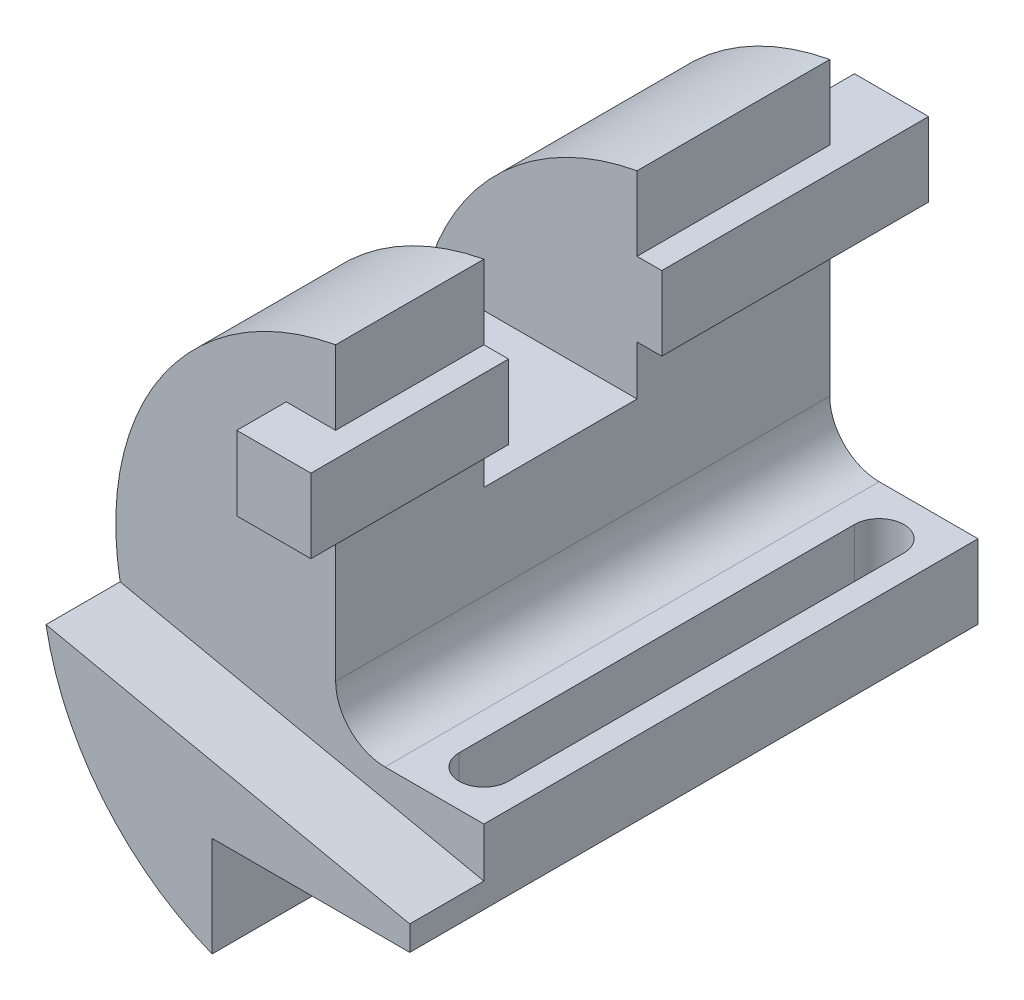
ISO-10303-21;
HEADER;
FILE_DESCRIPTION(('STEP AP214'),'2;1');
FILE_NAME('part.step','',(''),(''),'','','');
FILE_SCHEMA(('AUTOMOTIVE_DESIGN { 1 0 10303 214 1 1 1 1 }'));
ENDSEC;
DATA;
#1=APPLICATION_CONTEXT('core data for automotive mechanical design processes');
#2=APPLICATION_PROTOCOL_DEFINITION('international standard','automotive_design',2000,#1);
#3=PRODUCT_CONTEXT('',#1,'mechanical');
#4=PRODUCT('Part','Part','',(#3));
#5=PRODUCT_RELATED_PRODUCT_CATEGORY('part','',(#4));
#6=PRODUCT_DEFINITION_FORMATION('','',#4);
#7=PRODUCT_DEFINITION_CONTEXT('part definition',#1,'design');
#8=PRODUCT_DEFINITION('design','',#6,#7);
#9=PRODUCT_DEFINITION_SHAPE('','',#8);
#10=(LENGTH_UNIT() NAMED_UNIT(*) SI_UNIT(.MILLI.,.METRE.));
#11=(NAMED_UNIT(*) PLANE_ANGLE_UNIT() SI_UNIT($,.RADIAN.));
#12=(NAMED_UNIT(*) SI_UNIT($,.STERADIAN.) SOLID_ANGLE_UNIT());
#13=UNCERTAINTY_MEASURE_WITH_UNIT(LENGTH_MEASURE(1.E-05),#10,'distance_accuracy_value','');
#14=(GEOMETRIC_REPRESENTATION_CONTEXT(3) GLOBAL_UNCERTAINTY_ASSIGNED_CONTEXT((#13)) GLOBAL_UNIT_ASSIGNED_CONTEXT((#10,
#11,#12)) REPRESENTATION_CONTEXT('',''));
#15=CARTESIAN_POINT('',(0.,0.,0.));
#16=DIRECTION('',(0.,0.,1.));
#17=DIRECTION('',(1.,0.,0.));
#18=AXIS2_PLACEMENT_3D('',#15,#16,#17);
#19=CARTESIAN_POINT('',(0.,0.,-100.));
#20=DIRECTION('',(0.,0.,1.));
#21=DIRECTION('',(1.,0.,0.));
#22=AXIS2_PLACEMENT_3D('',#19,#20,#21);
#23=PLANE('',#22);
#24=DIRECTION('',(1.,0.,0.));
#25=VECTOR('',#24,1.);
#26=CARTESIAN_POINT('',(-4.99999999999999,38.5747141849586,-100.));
#27=LINE('',#26,#25);
#28=CARTESIAN_POINT('',(-20.,38.5747141849586,-100.));
#29=VERTEX_POINT('',#28);
#30=CARTESIAN_POINT('',(-9.99999999999999,38.5747141849586,-100.));
#31=VERTEX_POINT('',#30);
#32=EDGE_CURVE('E254',#29,#31,#27,.T.);
#33=ORIENTED_EDGE('',*,*,#32,.F.);
#34=DIRECTION('',(0.,1.,0.));
#35=VECTOR('',#34,1.);
#36=CARTESIAN_POINT('',(-20.,38.5747141849586,-100.));
#37=LINE('',#36,#35);
#38=CARTESIAN_POINT('',(-20.,23.5747141849586,-100.));
#39=VERTEX_POINT('',#38);
#40=EDGE_CURVE('E247',#39,#29,#37,.T.);
#41=ORIENTED_EDGE('',*,*,#40,.F.);
#42=DIRECTION('',(-1.,0.,0.));
#43=VECTOR('',#42,1.);
#44=CARTESIAN_POINT('',(-4.99999999999999,23.5747141849586,-100.));
#45=LINE('',#44,#43);
#46=CARTESIAN_POINT('',(-9.99999999999999,23.5747141849586,-100.));
#47=VERTEX_POINT('',#46);
#48=EDGE_CURVE('E262',#47,#39,#45,.T.);
#49=ORIENTED_EDGE('',*,*,#48,.F.);
#50=DIRECTION('',(0.,1.,0.));
#51=VECTOR('',#50,1.);
#52=CARTESIAN_POINT('',(-10.,53.5747141849586,-100.));
#53=LINE('',#52,#51);
#54=CARTESIAN_POINT('',(-9.99999999999999,-5.42528581504146,-100.));
#55=VERTEX_POINT('',#54);
#56=EDGE_CURVE('E399',#55,#47,#53,.T.);
#57=ORIENTED_EDGE('',*,*,#56,.F.);
#58=CARTESIAN_POINT('',(0.,-5.42528581504146,-100.));
#59=DIRECTION('',(0.,0.,-1.));
#60=DIRECTION('',(1.,0.,0.));
#61=AXIS2_PLACEMENT_3D('',#58,#59,#60);
#62=CIRCLE('',#61,9.99999999999999);
#63=CARTESIAN_POINT('',(0.,-15.4252858150414,-100.));
#64=VERTEX_POINT('',#63);
#65=EDGE_CURVE('E395',#64,#55,#62,.T.);
#66=ORIENTED_EDGE('',*,*,#65,.F.);
#67=DIRECTION('',(-1.,0.,0.));
#68=VECTOR('',#67,1.);
#69=CARTESIAN_POINT('',(0.,-15.4252858150414,-100.));
#70=LINE('',#69,#68);
#71=CARTESIAN_POINT('',(20.,-15.4252858150414,-100.));
#72=VERTEX_POINT('',#71);
#73=EDGE_CURVE('E392',#72,#64,#70,.T.);
#74=ORIENTED_EDGE('',*,*,#73,.F.);
#75=DIRECTION('',(0.,1.,0.));
#76=VECTOR('',#75,1.);
#77=CARTESIAN_POINT('',(20.,-15.4252858150414,-100.));
#78=LINE('',#77,#76);
#79=CARTESIAN_POINT('',(20.,-30.4252858150414,-100.));
#80=VERTEX_POINT('',#79);
#81=EDGE_CURVE('E389',#80,#72,#78,.T.);
#82=ORIENTED_EDGE('',*,*,#81,.F.);
#83=DIRECTION('',(1.,0.,0.));
#84=VECTOR('',#83,1.);
#85=CARTESIAN_POINT('',(20.,-30.4252858150414,-100.));
#86=LINE('',#85,#84);
#87=CARTESIAN_POINT('',(-20.,-30.4252858150415,-100.));
#88=VERTEX_POINT('',#87);
#89=EDGE_CURVE('E386',#88,#80,#86,.T.);
#90=ORIENTED_EDGE('',*,*,#89,.F.);
#91=DIRECTION('',(0.,1.,0.));
#92=VECTOR('',#91,1.);
#93=CARTESIAN_POINT('',(-20.,-30.4252858150415,-100.));
#94=LINE('',#93,#92);
#95=CARTESIAN_POINT('',(-20.,-50.6976330808451,-100.));
#96=VERTEX_POINT('',#95);
#97=EDGE_CURVE('E382',#96,#88,#94,.T.);
#98=ORIENTED_EDGE('',*,*,#97,.F.);
#99=CARTESIAN_POINT('',(0.,0.,-100.));
#100=DIRECTION('',(0.,0.,1.));
#101=DIRECTION('',(1.,0.,0.));
#102=AXIS2_PLACEMENT_3D('',#99,#100,#101);
#103=CIRCLE('',#102,54.5);
#104=CARTESIAN_POINT('',(-10.,53.5747141849586,-100.));
#105=VERTEX_POINT('',#104);
#106=EDGE_CURVE('E379',#105,#96,#103,.T.);
#107=ORIENTED_EDGE('',*,*,#106,.F.);
#108=EDGE_CURVE('E398',#31,#105,#53,.T.);
#109=ORIENTED_EDGE('',*,*,#108,.F.);
#110=EDGE_LOOP('',(#33,#41,#49,#57,#66,#74,#82,#90,#98,#107,#109));
#111=FACE_BOUND('',#110,.T.);
#112=ADVANCED_FACE('F37',(#111),#23,.F.);
#113=CARTESIAN_POINT('',(-10.,53.5747141849586,-100.));
#114=DIRECTION('',(1.,0.,0.));
#115=DIRECTION('',(0.,1.,0.));
#116=AXIS2_PLACEMENT_3D('',#113,#114,#115);
#117=PLANE('',#116);
#118=DIRECTION('',(0.,0.,1.));
#119=VECTOR('',#118,1.);
#120=CARTESIAN_POINT('',(-10.,38.5747141849586,-100.));
#121=LINE('',#120,#119);
#122=CARTESIAN_POINT('',(-10.,38.5747141849586,-61.));
#123=VERTEX_POINT('',#122);
#124=EDGE_CURVE('E289',#31,#123,#121,.T.);
#125=ORIENTED_EDGE('',*,*,#124,.F.);
#126=ORIENTED_EDGE('',*,*,#108,.T.);
#127=DIRECTION('',(0.,0.,1.));
#128=VECTOR('',#127,1.);
#129=CARTESIAN_POINT('',(-10.,53.5747141849586,-100.));
#130=LINE('',#129,#128);
#131=CARTESIAN_POINT('',(-10.,53.5747141849586,-61.));
#132=VERTEX_POINT('',#131);
#133=EDGE_CURVE('E266',#105,#132,#130,.T.);
#134=ORIENTED_EDGE('',*,*,#133,.T.);
#135=DIRECTION('',(0.,1.,0.));
#136=VECTOR('',#135,1.);
#137=CARTESIAN_POINT('',(-10.,53.5747141849586,-61.));
#138=LINE('',#137,#136);
#139=EDGE_CURVE('E298',#123,#132,#138,.T.);
#140=ORIENTED_EDGE('',*,*,#139,.F.);
#141=EDGE_LOOP('',(#125,#126,#134,#140));
#142=FACE_BOUND('',#141,.T.);
#143=ADVANCED_FACE('F453',(#142),#117,.T.);
#144=DIRECTION('',(0.,-1.,0.));
#145=VECTOR('',#144,1.);
#146=CARTESIAN_POINT('',(-10.,53.5747141849586,-30.));
#147=LINE('',#146,#145);
#148=CARTESIAN_POINT('',(-10.,53.5747141849586,-30.));
#149=VERTEX_POINT('',#148);
#150=CARTESIAN_POINT('',(-10.,38.5747141849586,-30.));
#151=VERTEX_POINT('',#150);
#152=EDGE_CURVE('E293',#149,#151,#147,.T.);
#153=ORIENTED_EDGE('',*,*,#152,.F.);
#154=CARTESIAN_POINT('',(-10.,53.5747141849586,0.));
#155=VERTEX_POINT('',#154);
#156=EDGE_CURVE('E417',#149,#155,#130,.T.);
#157=ORIENTED_EDGE('',*,*,#156,.T.);
#158=DIRECTION('',(0.,1.,0.));
#159=VECTOR('',#158,1.);
#160=CARTESIAN_POINT('',(-10.,53.5747141849586,0.));
#161=LINE('',#160,#159);
#162=CARTESIAN_POINT('',(-10.,38.5747141849586,0.));
#163=VERTEX_POINT('',#162);
#164=EDGE_CURVE('E412',#163,#155,#161,.T.);
#165=ORIENTED_EDGE('',*,*,#164,.F.);
#166=DIRECTION('',(0.,0.,1.));
#167=VECTOR('',#166,1.);
#168=CARTESIAN_POINT('',(-10.,38.5747141849586,-100.));
#169=LINE('',#168,#167);
#170=EDGE_CURVE('E352',#151,#163,#169,.T.);
#171=ORIENTED_EDGE('',*,*,#170,.F.);
#172=EDGE_LOOP('',(#153,#157,#165,#171));
#173=FACE_BOUND('',#172,.T.);
#174=ADVANCED_FACE('F459',(#173),#117,.T.);
#175=CARTESIAN_POINT('',(0.,0.,0.));
#176=DIRECTION('',(0.,0.,1.));
#177=DIRECTION('',(1.,0.,0.));
#178=AXIS2_PLACEMENT_3D('',#175,#176,#177);
#179=PLANE('',#178);
#180=DIRECTION('',(0.,-1.,0.));
#181=VECTOR('',#180,1.);
#182=CARTESIAN_POINT('',(-20.,38.5747141849586,0.));
#183=LINE('',#182,#181);
#184=CARTESIAN_POINT('',(-20.,38.5747141849586,0.));
#185=VERTEX_POINT('',#184);
#186=CARTESIAN_POINT('',(-20.,23.5747141849586,0.));
#187=VERTEX_POINT('',#186);
#188=EDGE_CURVE('E327',#185,#187,#183,.T.);
#189=ORIENTED_EDGE('',*,*,#188,.F.);
#190=DIRECTION('',(-1.,0.,0.));
#191=VECTOR('',#190,1.);
#192=CARTESIAN_POINT('',(-4.99999999999999,38.5747141849586,0.));
#193=LINE('',#192,#191);
#194=EDGE_CURVE('E312',#163,#185,#193,.T.);
#195=ORIENTED_EDGE('',*,*,#194,.F.);
#196=ORIENTED_EDGE('',*,*,#164,.T.);
#197=CARTESIAN_POINT('',(0.,0.,0.));
#198=DIRECTION('',(0.,0.,1.));
#199=DIRECTION('',(1.,0.,0.));
#200=AXIS2_PLACEMENT_3D('',#197,#198,#199);
#201=CIRCLE('',#200,54.5);
#202=CARTESIAN_POINT('',(-53.6157157125735,-9.77778239829923,0.));
#203=VERTEX_POINT('',#202);
#204=EDGE_CURVE('E378',#155,#203,#201,.T.);
#205=ORIENTED_EDGE('',*,*,#204,.T.);
#206=DIRECTION('',(-0.978147600733806,0.207911690817756,0.));
#207=VECTOR('',#206,1.);
#208=CARTESIAN_POINT('',(20.,-25.4252858150414,0.));
#209=LINE('',#208,#207);
#210=CARTESIAN_POINT('',(20.,-25.4252858150414,0.));
#211=VERTEX_POINT('',#210);
#212=EDGE_CURVE('E355',#211,#203,#209,.T.);
#213=ORIENTED_EDGE('',*,*,#212,.F.);
#214=DIRECTION('',(0.,1.,0.));
#215=VECTOR('',#214,1.);
#216=CARTESIAN_POINT('',(20.,-15.4252858150414,0.));
#217=LINE('',#216,#215);
#218=CARTESIAN_POINT('',(20.,-15.4252858150414,0.));
#219=VERTEX_POINT('',#218);
#220=EDGE_CURVE('E404',#211,#219,#217,.T.);
#221=ORIENTED_EDGE('',*,*,#220,.T.);
#222=DIRECTION('',(-1.,0.,0.));
#223=VECTOR('',#222,1.);
#224=CARTESIAN_POINT('',(0.,-15.4252858150414,0.));
#225=LINE('',#224,#223);
#226=CARTESIAN_POINT('',(0.,-15.4252858150414,0.));
#227=VERTEX_POINT('',#226);
#228=EDGE_CURVE('E406',#219,#227,#225,.T.);
#229=ORIENTED_EDGE('',*,*,#228,.T.);
#230=CARTESIAN_POINT('',(0.,-5.42528581504146,0.));
#231=DIRECTION('',(0.,0.,-1.));
#232=DIRECTION('',(1.,0.,0.));
#233=AXIS2_PLACEMENT_3D('',#230,#231,#232);
#234=CIRCLE('',#233,9.99999999999999);
#235=CARTESIAN_POINT('',(-9.99999999999999,-5.42528581504146,0.));
#236=VERTEX_POINT('',#235);
#237=EDGE_CURVE('E409',#227,#236,#234,.T.);
#238=ORIENTED_EDGE('',*,*,#237,.T.);
#239=CARTESIAN_POINT('',(-10.,23.5747141849586,0.));
#240=VERTEX_POINT('',#239);
#241=EDGE_CURVE('E383',#236,#240,#161,.T.);
#242=ORIENTED_EDGE('',*,*,#241,.T.);
#243=DIRECTION('',(1.,0.,0.));
#244=VECTOR('',#243,1.);
#245=CARTESIAN_POINT('',(-4.99999999999999,23.5747141849586,0.));
#246=LINE('',#245,#244);
#247=EDGE_CURVE('E317',#187,#240,#246,.T.);
#248=ORIENTED_EDGE('',*,*,#247,.F.);
#249=EDGE_LOOP('',(#189,#195,#196,#205,#213,#221,#229,#238,#242,#248));
#250=FACE_BOUND('',#249,.T.);
#251=ADVANCED_FACE('F467',(#250),#179,.T.);
#252=CARTESIAN_POINT('',(0.,0.,-100.));
#253=DIRECTION('',(0.,0.,1.));
#254=DIRECTION('',(1.,0.,0.));
#255=AXIS2_PLACEMENT_3D('',#252,#253,#254);
#256=CYLINDRICAL_SURFACE('',#255,54.5);
#257=CARTESIAN_POINT('',(0.,0.,-30.));
#258=DIRECTION('',(0.,0.,1.));
#259=DIRECTION('',(1.,0.,0.));
#260=AXIS2_PLACEMENT_3D('',#257,#258,#259);
#261=CIRCLE('',#260,54.5);
#262=CARTESIAN_POINT('',(-52.7823562831055,13.5747141849585,-30.));
#263=VERTEX_POINT('',#262);
#264=EDGE_CURVE('E305',#263,#149,#261,.F.);
#265=ORIENTED_EDGE('',*,*,#264,.F.);
#266=DIRECTION('',(0.,0.,1.));
#267=VECTOR('',#266,1.);
#268=CARTESIAN_POINT('',(-52.7823562831055,13.5747141849585,-100.));
#269=LINE('',#268,#267);
#270=CARTESIAN_POINT('',(-52.7823562831055,13.5747141849585,-61.));
#271=VERTEX_POINT('',#270);
#272=EDGE_CURVE('E308',#271,#263,#269,.T.);
#273=ORIENTED_EDGE('',*,*,#272,.F.);
#274=CARTESIAN_POINT('',(0.,0.,-61.));
#275=DIRECTION('',(0.,0.,-1.));
#276=DIRECTION('',(-1.,0.,0.));
#277=AXIS2_PLACEMENT_3D('',#274,#275,#276);
#278=CIRCLE('',#277,54.5);
#279=EDGE_CURVE('E310',#132,#271,#278,.F.);
#280=ORIENTED_EDGE('',*,*,#279,.F.);
#281=ORIENTED_EDGE('',*,*,#133,.F.);
#282=ORIENTED_EDGE('',*,*,#106,.T.);
#283=DIRECTION('',(0.,0.,1.));
#284=VECTOR('',#283,1.);
#285=CARTESIAN_POINT('',(-20.,-50.6976330808451,-100.));
#286=LINE('',#285,#284);
#287=CARTESIAN_POINT('',(-20.,-50.6976330808451,15.));
#288=VERTEX_POINT('',#287);
#289=EDGE_CURVE('E402',#96,#288,#286,.T.);
#290=ORIENTED_EDGE('',*,*,#289,.T.);
#291=CARTESIAN_POINT('',(7.42461647718073E-13,5.03069808033274E-13,15.));
#292=DIRECTION('',(0.,0.,1.));
#293=DIRECTION('',(-1.,0.,0.));
#294=AXIS2_PLACEMENT_3D('',#291,#292,#293);
#295=CIRCLE('',#294,54.5000000000008);
#296=CARTESIAN_POINT('',(-53.6157157125735,-9.77778239829923,15.));
#297=VERTEX_POINT('',#296);
#298=EDGE_CURVE('E359',#297,#288,#295,.T.);
#299=ORIENTED_EDGE('',*,*,#298,.F.);
#300=DIRECTION('',(0.,0.,-1.));
#301=VECTOR('',#300,1.);
#302=CARTESIAN_POINT('',(-53.6157157125735,-9.77778239829923,15.));
#303=LINE('',#302,#301);
#304=EDGE_CURVE('E375',#297,#203,#303,.T.);
#305=ORIENTED_EDGE('',*,*,#304,.T.);
#306=ORIENTED_EDGE('',*,*,#204,.F.);
#307=ORIENTED_EDGE('',*,*,#156,.F.);
#308=EDGE_LOOP('',(#265,#273,#280,#281,#282,#290,#299,#305,#306,#307));
#309=FACE_BOUND('',#308,.T.);
#310=ADVANCED_FACE('F39',(#309),#256,.T.);
#311=DIRECTION('',(0.,0.,-1.));
#312=VECTOR('',#311,1.);
#313=CARTESIAN_POINT('',(-9.99999999999999,23.5747141849586,-100.));
#314=LINE('',#313,#312);
#315=CARTESIAN_POINT('',(-9.99999999999999,23.5747141849586,-61.));
#316=VERTEX_POINT('',#315);
#317=EDGE_CURVE('E286',#316,#47,#314,.T.);
#318=ORIENTED_EDGE('',*,*,#317,.F.);
#319=CARTESIAN_POINT('',(-9.99999999999999,13.5747141849586,-61.));
#320=VERTEX_POINT('',#319);
#321=EDGE_CURVE('E299',#320,#316,#138,.T.);
#322=ORIENTED_EDGE('',*,*,#321,.F.);
#323=DIRECTION('',(0.,0.,-1.));
#324=VECTOR('',#323,1.);
#325=CARTESIAN_POINT('',(-9.99999999999999,13.5747141849586,-30.));
#326=LINE('',#325,#324);
#327=CARTESIAN_POINT('',(-9.99999999999999,13.5747141849586,-30.));
#328=VERTEX_POINT('',#327);
#329=EDGE_CURVE('E295',#328,#320,#326,.T.);
#330=ORIENTED_EDGE('',*,*,#329,.F.);
#331=CARTESIAN_POINT('',(-9.99999999999999,23.5747141849586,-30.));
#332=VERTEX_POINT('',#331);
#333=EDGE_CURVE('E292',#332,#328,#147,.T.);
#334=ORIENTED_EDGE('',*,*,#333,.F.);
#335=DIRECTION('',(0.,0.,-1.));
#336=VECTOR('',#335,1.);
#337=CARTESIAN_POINT('',(-9.99999999999999,23.5747141849586,-100.));
#338=LINE('',#337,#336);
#339=EDGE_CURVE('E348',#240,#332,#338,.T.);
#340=ORIENTED_EDGE('',*,*,#339,.F.);
#341=ORIENTED_EDGE('',*,*,#241,.F.);
#342=DIRECTION('',(0.,0.,1.));
#343=VECTOR('',#342,1.);
#344=CARTESIAN_POINT('',(-9.99999999999999,-5.42528581504146,-100.));
#345=LINE('',#344,#343);
#346=EDGE_CURVE('E418',#55,#236,#345,.T.);
#347=ORIENTED_EDGE('',*,*,#346,.F.);
#348=ORIENTED_EDGE('',*,*,#56,.T.);
#349=EDGE_LOOP('',(#318,#322,#330,#334,#340,#341,#347,#348));
#350=FACE_BOUND('',#349,.T.);
#351=ADVANCED_FACE('F462',(#350),#117,.T.);
#352=CARTESIAN_POINT('',(0.,-5.42528581504146,-100.));
#353=DIRECTION('',(0.,0.,1.));
#354=DIRECTION('',(1.,0.,0.));
#355=AXIS2_PLACEMENT_3D('',#352,#353,#354);
#356=CYLINDRICAL_SURFACE('',#355,9.99999999999999);
#357=ORIENTED_EDGE('',*,*,#237,.F.);
#358=DIRECTION('',(0.,0.,1.));
#359=VECTOR('',#358,1.);
#360=CARTESIAN_POINT('',(0.,-15.4252858150414,-100.));
#361=LINE('',#360,#359);
#362=EDGE_CURVE('E420',#64,#227,#361,.T.);
#363=ORIENTED_EDGE('',*,*,#362,.F.);
#364=ORIENTED_EDGE('',*,*,#65,.T.);
#365=ORIENTED_EDGE('',*,*,#346,.T.);
#366=EDGE_LOOP('',(#357,#363,#364,#365));
#367=FACE_BOUND('',#366,.T.);
#368=ADVANCED_FACE('F472',(#367),#356,.F.);
#369=CARTESIAN_POINT('',(0.,-15.4252858150414,-100.));
#370=DIRECTION('',(0.,1.,0.));
#371=DIRECTION('',(0.,0.,1.));
#372=AXIS2_PLACEMENT_3D('',#369,#370,#371);
#373=PLANE('',#372);
#374=CARTESIAN_POINT('',(10.,-15.4252858150414,-10.));
#375=DIRECTION('',(0.,1.,0.));
#376=DIRECTION('',(0.,0.,1.));
#377=AXIS2_PLACEMENT_3D('',#374,#375,#376);
#378=CIRCLE('',#377,5.);
#379=CARTESIAN_POINT('',(5.,-15.4252858150414,-10.));
#380=VERTEX_POINT('',#379);
#381=CARTESIAN_POINT('',(15.,-15.4252858150414,-9.99999999999999));
#382=VERTEX_POINT('',#381);
#383=EDGE_CURVE('E52',#380,#382,#378,.T.);
#384=ORIENTED_EDGE('',*,*,#383,.F.);
#385=DIRECTION('',(0.,0.,1.));
#386=VECTOR('',#385,1.);
#387=CARTESIAN_POINT('',(5.,-15.4252858150414,-10.));
#388=LINE('',#387,#386);
#389=CARTESIAN_POINT('',(5.,-15.4252858150414,-90.));
#390=VERTEX_POINT('',#389);
#391=EDGE_CURVE('E240',#390,#380,#388,.T.);
#392=ORIENTED_EDGE('',*,*,#391,.F.);
#393=CARTESIAN_POINT('',(10.,-15.4252858150414,-90.));
#394=DIRECTION('',(0.,1.,0.));
#395=DIRECTION('',(0.,0.,-1.));
#396=AXIS2_PLACEMENT_3D('',#393,#394,#395);
#397=CIRCLE('',#396,5.);
#398=CARTESIAN_POINT('',(15.,-15.4252858150414,-90.));
#399=VERTEX_POINT('',#398);
#400=EDGE_CURVE('E224',#399,#390,#397,.T.);
#401=ORIENTED_EDGE('',*,*,#400,.F.);
#402=DIRECTION('',(0.,0.,-1.));
#403=VECTOR('',#402,1.);
#404=CARTESIAN_POINT('',(15.,-15.4252858150414,-10.));
#405=LINE('',#404,#403);
#406=EDGE_CURVE('E233',#382,#399,#405,.T.);
#407=ORIENTED_EDGE('',*,*,#406,.F.);
#408=EDGE_LOOP('',(#384,#392,#401,#407));
#409=FACE_BOUND('',#408,.T.);
#410=ORIENTED_EDGE('',*,*,#228,.F.);
#411=DIRECTION('',(0.,0.,1.));
#412=VECTOR('',#411,1.);
#413=CARTESIAN_POINT('',(20.,-15.4252858150414,-100.));
#414=LINE('',#413,#412);
#415=EDGE_CURVE('E422',#72,#219,#414,.T.);
#416=ORIENTED_EDGE('',*,*,#415,.F.);
#417=ORIENTED_EDGE('',*,*,#73,.T.);
#418=ORIENTED_EDGE('',*,*,#362,.T.);
#419=EDGE_LOOP('',(#410,#416,#417,#418));
#420=FACE_BOUND('',#419,.T.);
#421=ADVANCED_FACE('F237',(#409,#420),#373,.T.);
#422=CARTESIAN_POINT('',(20.,-15.4252858150414,-100.));
#423=DIRECTION('',(1.,0.,0.));
#424=DIRECTION('',(0.,1.,0.));
#425=AXIS2_PLACEMENT_3D('',#422,#423,#424);
#426=PLANE('',#425);
#427=ORIENTED_EDGE('',*,*,#220,.F.);
#428=DIRECTION('',(0.,0.,-1.));
#429=VECTOR('',#428,1.);
#430=CARTESIAN_POINT('',(20.,-25.4252858150414,15.));
#431=LINE('',#430,#429);
#432=CARTESIAN_POINT('',(20.,-25.4252858150414,15.));
#433=VERTEX_POINT('',#432);
#434=EDGE_CURVE('E370',#433,#211,#431,.T.);
#435=ORIENTED_EDGE('',*,*,#434,.F.);
#436=DIRECTION('',(0.,1.,0.));
#437=VECTOR('',#436,1.);
#438=CARTESIAN_POINT('',(20.,-25.4252858150414,15.));
#439=LINE('',#438,#437);
#440=CARTESIAN_POINT('',(20.,-30.4252858150414,15.));
#441=VERTEX_POINT('',#440);
#442=EDGE_CURVE('E368',#441,#433,#439,.T.);
#443=ORIENTED_EDGE('',*,*,#442,.F.);
#444=DIRECTION('',(0.,0.,1.));
#445=VECTOR('',#444,1.);
#446=CARTESIAN_POINT('',(20.,-30.4252858150414,-100.));
#447=LINE('',#446,#445);
#448=EDGE_CURVE('E425',#80,#441,#447,.T.);
#449=ORIENTED_EDGE('',*,*,#448,.F.);
#450=ORIENTED_EDGE('',*,*,#81,.T.);
#451=ORIENTED_EDGE('',*,*,#415,.T.);
#452=EDGE_LOOP('',(#427,#435,#443,#449,#450,#451));
#453=FACE_BOUND('',#452,.T.);
#454=ADVANCED_FACE('F479',(#453),#426,.T.);
#455=CARTESIAN_POINT('',(20.,-30.4252858150414,-100.));
#456=DIRECTION('',(0.,-1.,0.));
#457=DIRECTION('',(1.,0.,0.));
#458=AXIS2_PLACEMENT_3D('',#455,#456,#457);
#459=PLANE('',#458);
#460=CARTESIAN_POINT('',(10.,-30.4252858150414,-10.));
#461=DIRECTION('',(0.,-1.,0.));
#462=DIRECTION('',(1.,0.,0.));
#463=AXIS2_PLACEMENT_3D('',#460,#461,#462);
#464=CIRCLE('',#463,5.);
#465=CARTESIAN_POINT('',(15.,-30.4252858150414,-10.));
#466=VERTEX_POINT('',#465);
#467=CARTESIAN_POINT('',(5.,-30.4252858150414,-10.));
#468=VERTEX_POINT('',#467);
#469=EDGE_CURVE('E11',#466,#468,#464,.T.);
#470=ORIENTED_EDGE('',*,*,#469,.F.);
#471=DIRECTION('',(0.,0.,1.));
#472=VECTOR('',#471,1.);
#473=CARTESIAN_POINT('',(15.,-30.4252858150414,-100.));
#474=LINE('',#473,#472);
#475=CARTESIAN_POINT('',(15.,-30.4252858150414,-90.));
#476=VERTEX_POINT('',#475);
#477=EDGE_CURVE('E265',#476,#466,#474,.T.);
#478=ORIENTED_EDGE('',*,*,#477,.F.);
#479=CARTESIAN_POINT('',(10.,-30.4252858150414,-90.));
#480=DIRECTION('',(0.,-1.,0.));
#481=DIRECTION('',(1.,0.,0.));
#482=AXIS2_PLACEMENT_3D('',#479,#480,#481);
#483=CIRCLE('',#482,5.);
#484=CARTESIAN_POINT('',(5.,-30.4252858150414,-90.));
#485=VERTEX_POINT('',#484);
#486=EDGE_CURVE('E227',#485,#476,#483,.T.);
#487=ORIENTED_EDGE('',*,*,#486,.F.);
#488=DIRECTION('',(0.,0.,-1.));
#489=VECTOR('',#488,1.);
#490=CARTESIAN_POINT('',(5.,-30.4252858150414,-100.));
#491=LINE('',#490,#489);
#492=EDGE_CURVE('E45',#468,#485,#491,.T.);
#493=ORIENTED_EDGE('',*,*,#492,.F.);
#494=EDGE_LOOP('',(#470,#478,#487,#493));
#495=FACE_BOUND('',#494,.T.);
#496=ORIENTED_EDGE('',*,*,#448,.T.);
#497=DIRECTION('',(1.,0.,0.));
#498=VECTOR('',#497,1.);
#499=CARTESIAN_POINT('',(20.,-30.4252858150414,15.));
#500=LINE('',#499,#498);
#501=CARTESIAN_POINT('',(-20.,-30.4252858150415,15.));
#502=VERTEX_POINT('',#501);
#503=EDGE_CURVE('E365',#502,#441,#500,.T.);
#504=ORIENTED_EDGE('',*,*,#503,.F.);
#505=DIRECTION('',(0.,0.,1.));
#506=VECTOR('',#505,1.);
#507=CARTESIAN_POINT('',(-20.,-30.4252858150415,-100.));
#508=LINE('',#507,#506);
#509=EDGE_CURVE('E427',#88,#502,#508,.T.);
#510=ORIENTED_EDGE('',*,*,#509,.F.);
#511=ORIENTED_EDGE('',*,*,#89,.T.);
#512=EDGE_LOOP('',(#496,#504,#510,#511));
#513=FACE_BOUND('',#512,.T.);
#514=ADVANCED_FACE('F437',(#495,#513),#459,.T.);
#515=CARTESIAN_POINT('',(-20.,-30.4252858150415,-100.));
#516=DIRECTION('',(1.,0.,0.));
#517=DIRECTION('',(0.,1.,0.));
#518=AXIS2_PLACEMENT_3D('',#515,#516,#517);
#519=PLANE('',#518);
#520=ORIENTED_EDGE('',*,*,#509,.T.);
#521=DIRECTION('',(0.,1.,0.));
#522=VECTOR('',#521,1.);
#523=CARTESIAN_POINT('',(-20.,-30.4252858150415,15.));
#524=LINE('',#523,#522);
#525=EDGE_CURVE('E362',#288,#502,#524,.T.);
#526=ORIENTED_EDGE('',*,*,#525,.F.);
#527=ORIENTED_EDGE('',*,*,#289,.F.);
#528=ORIENTED_EDGE('',*,*,#97,.T.);
#529=EDGE_LOOP('',(#520,#526,#527,#528));
#530=FACE_BOUND('',#529,.T.);
#531=ADVANCED_FACE('F484',(#530),#519,.T.);
#532=CARTESIAN_POINT('',(20.,-25.4252858150414,15.));
#533=DIRECTION('',(-0.207911690817756,-0.978147600733806,0.));
#534=DIRECTION('',(0.978147600733806,-0.207911690817756,0.));
#535=AXIS2_PLACEMENT_3D('',#532,#533,#534);
#536=PLANE('',#535);
#537=ORIENTED_EDGE('',*,*,#212,.T.);
#538=ORIENTED_EDGE('',*,*,#304,.F.);
#539=DIRECTION('',(-0.978147600733806,0.207911690817756,0.));
#540=VECTOR('',#539,1.);
#541=CARTESIAN_POINT('',(20.,-25.4252858150414,15.));
#542=LINE('',#541,#540);
#543=EDGE_CURVE('E356',#433,#297,#542,.T.);
#544=ORIENTED_EDGE('',*,*,#543,.F.);
#545=ORIENTED_EDGE('',*,*,#434,.T.);
#546=EDGE_LOOP('',(#537,#538,#544,#545));
#547=FACE_BOUND('',#546,.T.);
#548=ADVANCED_FACE('F465',(#547),#536,.F.);
#549=CARTESIAN_POINT('',(7.42461647718073E-13,5.03069808033274E-13,15.));
#550=DIRECTION('',(0.,0.,-1.));
#551=DIRECTION('',(-1.,0.,0.));
#552=AXIS2_PLACEMENT_3D('',#549,#550,#551);
#553=PLANE('',#552);
#554=ORIENTED_EDGE('',*,*,#543,.T.);
#555=ORIENTED_EDGE('',*,*,#298,.T.);
#556=ORIENTED_EDGE('',*,*,#525,.T.);
#557=ORIENTED_EDGE('',*,*,#503,.T.);
#558=ORIENTED_EDGE('',*,*,#442,.T.);
#559=EDGE_LOOP('',(#554,#555,#556,#557,#558));
#560=FACE_BOUND('',#559,.T.);
#561=ADVANCED_FACE('F490',(#560),#553,.F.);
#562=CARTESIAN_POINT('',(-20.,38.5747141849586,-30.));
#563=DIRECTION('',(0.,1.,0.));
#564=DIRECTION('',(0.,0.,1.));
#565=AXIS2_PLACEMENT_3D('',#562,#563,#564);
#566=PLANE('',#565);
#567=DIRECTION('',(-1.,0.,0.));
#568=VECTOR('',#567,1.);
#569=CARTESIAN_POINT('',(-20.,38.5747141849586,-30.));
#570=LINE('',#569,#568);
#571=CARTESIAN_POINT('',(-4.99999999999999,38.5747141849586,-30.));
#572=VERTEX_POINT('',#571);
#573=EDGE_CURVE('E342',#572,#151,#570,.T.);
#574=ORIENTED_EDGE('',*,*,#573,.T.);
#575=ORIENTED_EDGE('',*,*,#170,.T.);
#576=ORIENTED_EDGE('',*,*,#194,.T.);
#577=DIRECTION('',(0.,0.,-1.));
#578=VECTOR('',#577,1.);
#579=CARTESIAN_POINT('',(-20.,38.5747141849586,10.));
#580=LINE('',#579,#578);
#581=CARTESIAN_POINT('',(-20.,38.5747141849586,10.));
#582=VERTEX_POINT('',#581);
#583=EDGE_CURVE('E334',#582,#185,#580,.T.);
#584=ORIENTED_EDGE('',*,*,#583,.F.);
#585=DIRECTION('',(-1.,0.,0.));
#586=VECTOR('',#585,1.);
#587=CARTESIAN_POINT('',(-4.99999999999999,38.5747141849586,10.));
#588=LINE('',#587,#586);
#589=CARTESIAN_POINT('',(-4.99999999999999,38.5747141849586,10.));
#590=VERTEX_POINT('',#589);
#591=EDGE_CURVE('E316',#590,#582,#588,.T.);
#592=ORIENTED_EDGE('',*,*,#591,.F.);
#593=DIRECTION('',(0.,0.,1.));
#594=VECTOR('',#593,1.);
#595=CARTESIAN_POINT('',(-4.99999999999999,38.5747141849586,-30.));
#596=LINE('',#595,#594);
#597=EDGE_CURVE('E346',#572,#590,#596,.T.);
#598=ORIENTED_EDGE('',*,*,#597,.F.);
#599=EDGE_LOOP('',(#574,#575,#576,#584,#592,#598));
#600=FACE_BOUND('',#599,.T.);
#601=ADVANCED_FACE('F536',(#600),#566,.T.);
#602=CARTESIAN_POINT('',(-4.99999999999999,38.5747141849586,-30.));
#603=DIRECTION('',(1.,0.,0.));
#604=DIRECTION('',(0.,1.,0.));
#605=AXIS2_PLACEMENT_3D('',#602,#603,#604);
#606=PLANE('',#605);
#607=ORIENTED_EDGE('',*,*,#597,.T.);
#608=DIRECTION('',(0.,1.,0.));
#609=VECTOR('',#608,1.);
#610=CARTESIAN_POINT('',(-4.99999999999999,38.5747141849586,10.));
#611=LINE('',#610,#609);
#612=CARTESIAN_POINT('',(-4.99999999999999,23.5747141849586,10.));
#613=VERTEX_POINT('',#612);
#614=EDGE_CURVE('E313',#613,#590,#611,.T.);
#615=ORIENTED_EDGE('',*,*,#614,.F.);
#616=DIRECTION('',(0.,0.,1.));
#617=VECTOR('',#616,1.);
#618=CARTESIAN_POINT('',(-4.99999999999999,23.5747141849586,-30.));
#619=LINE('',#618,#617);
#620=CARTESIAN_POINT('',(-4.99999999999999,23.5747141849586,-30.));
#621=VERTEX_POINT('',#620);
#622=EDGE_CURVE('E345',#621,#613,#619,.T.);
#623=ORIENTED_EDGE('',*,*,#622,.F.);
#624=DIRECTION('',(0.,1.,0.));
#625=VECTOR('',#624,1.);
#626=CARTESIAN_POINT('',(-4.99999999999999,38.5747141849586,-30.));
#627=LINE('',#626,#625);
#628=EDGE_CURVE('E339',#621,#572,#627,.T.);
#629=ORIENTED_EDGE('',*,*,#628,.T.);
#630=EDGE_LOOP('',(#607,#615,#623,#629));
#631=FACE_BOUND('',#630,.T.);
#632=ADVANCED_FACE('F550',(#631),#606,.T.);
#633=CARTESIAN_POINT('',(-20.,23.5747141849586,-30.));
#634=DIRECTION('',(0.,-1.,0.));
#635=DIRECTION('',(0.,0.,-1.));
#636=AXIS2_PLACEMENT_3D('',#633,#634,#635);
#637=PLANE('',#636);
#638=ORIENTED_EDGE('',*,*,#622,.T.);
#639=DIRECTION('',(1.,0.,0.));
#640=VECTOR('',#639,1.);
#641=CARTESIAN_POINT('',(-4.99999999999999,23.5747141849586,10.));
#642=LINE('',#641,#640);
#643=CARTESIAN_POINT('',(-20.,23.5747141849586,10.));
#644=VERTEX_POINT('',#643);
#645=EDGE_CURVE('E321',#644,#613,#642,.T.);
#646=ORIENTED_EDGE('',*,*,#645,.F.);
#647=DIRECTION('',(0.,0.,-1.));
#648=VECTOR('',#647,1.);
#649=CARTESIAN_POINT('',(-20.,23.5747141849586,10.));
#650=LINE('',#649,#648);
#651=EDGE_CURVE('E324',#644,#187,#650,.T.);
#652=ORIENTED_EDGE('',*,*,#651,.T.);
#653=ORIENTED_EDGE('',*,*,#247,.T.);
#654=ORIENTED_EDGE('',*,*,#339,.T.);
#655=DIRECTION('',(1.,0.,0.));
#656=VECTOR('',#655,1.);
#657=CARTESIAN_POINT('',(-20.,23.5747141849586,-30.));
#658=LINE('',#657,#656);
#659=EDGE_CURVE('E337',#332,#621,#658,.T.);
#660=ORIENTED_EDGE('',*,*,#659,.T.);
#661=EDGE_LOOP('',(#638,#646,#652,#653,#654,#660));
#662=FACE_BOUND('',#661,.T.);
#663=ADVANCED_FACE('F589',(#662),#637,.T.);
#664=CARTESIAN_POINT('',(0.,0.,-30.));
#665=DIRECTION('',(0.,0.,1.));
#666=DIRECTION('',(1.,0.,0.));
#667=AXIS2_PLACEMENT_3D('',#664,#665,#666);
#668=PLANE('',#667);
#669=ORIENTED_EDGE('',*,*,#659,.F.);
#670=ORIENTED_EDGE('',*,*,#333,.T.);
#671=DIRECTION('',(1.,0.,0.));
#672=VECTOR('',#671,1.);
#673=CARTESIAN_POINT('',(-54.5,13.5747141849585,-30.));
#674=LINE('',#673,#672);
#675=EDGE_CURVE('E302',#263,#328,#674,.T.);
#676=ORIENTED_EDGE('',*,*,#675,.F.);
#677=ORIENTED_EDGE('',*,*,#264,.T.);
#678=ORIENTED_EDGE('',*,*,#152,.T.);
#679=ORIENTED_EDGE('',*,*,#573,.F.);
#680=ORIENTED_EDGE('',*,*,#628,.F.);
#681=EDGE_LOOP('',(#669,#670,#676,#677,#678,#679,#680));
#682=FACE_BOUND('',#681,.T.);
#683=ADVANCED_FACE('F553',(#682),#668,.F.);
#684=CARTESIAN_POINT('',(-20.,38.5747141849586,10.));
#685=DIRECTION('',(1.,0.,0.));
#686=DIRECTION('',(0.,1.,0.));
#687=AXIS2_PLACEMENT_3D('',#684,#685,#686);
#688=PLANE('',#687);
#689=ORIENTED_EDGE('',*,*,#188,.T.);
#690=ORIENTED_EDGE('',*,*,#651,.F.);
#691=DIRECTION('',(0.,-1.,0.));
#692=VECTOR('',#691,1.);
#693=CARTESIAN_POINT('',(-20.,38.5747141849586,10.));
#694=LINE('',#693,#692);
#695=EDGE_CURVE('E319',#582,#644,#694,.T.);
#696=ORIENTED_EDGE('',*,*,#695,.F.);
#697=ORIENTED_EDGE('',*,*,#583,.T.);
#698=EDGE_LOOP('',(#689,#690,#696,#697));
#699=FACE_BOUND('',#698,.T.);
#700=ADVANCED_FACE('F541',(#699),#688,.F.);
#701=CARTESIAN_POINT('',(0.,0.,10.));
#702=DIRECTION('',(0.,0.,-1.));
#703=DIRECTION('',(-1.,0.,0.));
#704=AXIS2_PLACEMENT_3D('',#701,#702,#703);
#705=PLANE('',#704);
#706=ORIENTED_EDGE('',*,*,#614,.T.);
#707=ORIENTED_EDGE('',*,*,#591,.T.);
#708=ORIENTED_EDGE('',*,*,#695,.T.);
#709=ORIENTED_EDGE('',*,*,#645,.T.);
#710=EDGE_LOOP('',(#706,#707,#708,#709));
#711=FACE_BOUND('',#710,.T.);
#712=ADVANCED_FACE('F544',(#711),#705,.F.);
#713=CARTESIAN_POINT('',(-54.5,53.5747141849586,-61.));
#714=DIRECTION('',(0.,0.,-1.));
#715=DIRECTION('',(-1.,0.,0.));
#716=AXIS2_PLACEMENT_3D('',#713,#714,#715);
#717=PLANE('',#716);
#718=ORIENTED_EDGE('',*,*,#321,.T.);
#719=DIRECTION('',(1.,0.,0.));
#720=VECTOR('',#719,1.);
#721=CARTESIAN_POINT('',(-4.99999999999999,23.5747141849586,-61.));
#722=LINE('',#721,#720);
#723=CARTESIAN_POINT('',(-4.99999999999999,23.5747141849586,-61.));
#724=VERTEX_POINT('',#723);
#725=EDGE_CURVE('E282',#316,#724,#722,.T.);
#726=ORIENTED_EDGE('',*,*,#725,.T.);
#727=DIRECTION('',(0.,1.,0.));
#728=VECTOR('',#727,1.);
#729=CARTESIAN_POINT('',(-4.99999999999999,38.5747141849586,-61.));
#730=LINE('',#729,#728);
#731=CARTESIAN_POINT('',(-4.99999999999999,38.5747141849586,-61.));
#732=VERTEX_POINT('',#731);
#733=EDGE_CURVE('E279',#724,#732,#730,.T.);
#734=ORIENTED_EDGE('',*,*,#733,.T.);
#735=DIRECTION('',(-1.,0.,0.));
#736=VECTOR('',#735,1.);
#737=CARTESIAN_POINT('',(-4.99999999999999,38.5747141849586,-61.));
#738=LINE('',#737,#736);
#739=EDGE_CURVE('E277',#732,#123,#738,.T.);
#740=ORIENTED_EDGE('',*,*,#739,.T.);
#741=ORIENTED_EDGE('',*,*,#139,.T.);
#742=ORIENTED_EDGE('',*,*,#279,.T.);
#743=DIRECTION('',(1.,0.,0.));
#744=VECTOR('',#743,1.);
#745=CARTESIAN_POINT('',(-54.5,13.5747141849585,-61.));
#746=LINE('',#745,#744);
#747=EDGE_CURVE('E303',#271,#320,#746,.T.);
#748=ORIENTED_EDGE('',*,*,#747,.T.);
#749=EDGE_LOOP('',(#718,#726,#734,#740,#741,#742,#748));
#750=FACE_BOUND('',#749,.T.);
#751=ADVANCED_FACE('F565',(#750),#717,.F.);
#752=CARTESIAN_POINT('',(-54.5,13.5747141849585,-30.));
#753=DIRECTION('',(0.,-1.,0.));
#754=DIRECTION('',(1.,0.,0.));
#755=AXIS2_PLACEMENT_3D('',#752,#753,#754);
#756=PLANE('',#755);
#757=ORIENTED_EDGE('',*,*,#272,.T.);
#758=ORIENTED_EDGE('',*,*,#675,.T.);
#759=ORIENTED_EDGE('',*,*,#329,.T.);
#760=ORIENTED_EDGE('',*,*,#747,.F.);
#761=EDGE_LOOP('',(#757,#758,#759,#760));
#762=FACE_BOUND('',#761,.T.);
#763=ADVANCED_FACE('F561',(#762),#756,.F.);
#764=CARTESIAN_POINT('',(-4.99999999999999,38.5747141849586,-39.7867965644036));
#765=DIRECTION('',(1.,0.,0.));
#766=DIRECTION('',(0.,1.,0.));
#767=AXIS2_PLACEMENT_3D('',#764,#765,#766);
#768=PLANE('',#767);
#769=ORIENTED_EDGE('',*,*,#733,.F.);
#770=DIRECTION('',(0.,0.,-1.));
#771=VECTOR('',#770,1.);
#772=CARTESIAN_POINT('',(-4.99999999999999,23.5747141849586,-39.7867965644036));
#773=LINE('',#772,#771);
#774=CARTESIAN_POINT('',(-4.99999999999999,23.5747141849586,-115.));
#775=VERTEX_POINT('',#774);
#776=EDGE_CURVE('E276',#724,#775,#773,.T.);
#777=ORIENTED_EDGE('',*,*,#776,.T.);
#778=DIRECTION('',(0.,-1.,0.));
#779=VECTOR('',#778,1.);
#780=CARTESIAN_POINT('',(-4.99999999999999,38.5747141849586,-115.));
#781=LINE('',#780,#779);
#782=CARTESIAN_POINT('',(-4.99999999999999,38.5747141849586,-115.));
#783=VERTEX_POINT('',#782);
#784=EDGE_CURVE('E250',#783,#775,#781,.T.);
#785=ORIENTED_EDGE('',*,*,#784,.F.);
#786=DIRECTION('',(0.,0.,-1.));
#787=VECTOR('',#786,1.);
#788=CARTESIAN_POINT('',(-4.99999999999999,38.5747141849586,-39.7867965644036));
#789=LINE('',#788,#787);
#790=EDGE_CURVE('E280',#732,#783,#789,.T.);
#791=ORIENTED_EDGE('',*,*,#790,.F.);
#792=EDGE_LOOP('',(#769,#777,#785,#791));
#793=FACE_BOUND('',#792,.T.);
#794=ADVANCED_FACE('F570',(#793),#768,.T.);
#795=CARTESIAN_POINT('',(-4.99999999999999,38.5747141849586,-39.7867965644036));
#796=DIRECTION('',(0.,1.,0.));
#797=DIRECTION('',(0.,0.,1.));
#798=AXIS2_PLACEMENT_3D('',#795,#796,#797);
#799=PLANE('',#798);
#800=ORIENTED_EDGE('',*,*,#790,.T.);
#801=DIRECTION('',(1.,0.,0.));
#802=VECTOR('',#801,1.);
#803=CARTESIAN_POINT('',(-4.99999999999999,38.5747141849586,-115.));
#804=LINE('',#803,#802);
#805=CARTESIAN_POINT('',(-20.,38.5747141849586,-115.));
#806=VERTEX_POINT('',#805);
#807=EDGE_CURVE('E258',#806,#783,#804,.T.);
#808=ORIENTED_EDGE('',*,*,#807,.F.);
#809=DIRECTION('',(0.,0.,1.));
#810=VECTOR('',#809,1.);
#811=CARTESIAN_POINT('',(-20.,38.5747141849586,-115.));
#812=LINE('',#811,#810);
#813=EDGE_CURVE('E261',#806,#29,#812,.T.);
#814=ORIENTED_EDGE('',*,*,#813,.T.);
#815=ORIENTED_EDGE('',*,*,#32,.T.);
#816=ORIENTED_EDGE('',*,*,#124,.T.);
#817=ORIENTED_EDGE('',*,*,#739,.F.);
#818=EDGE_LOOP('',(#800,#808,#814,#815,#816,#817));
#819=FACE_BOUND('',#818,.T.);
#820=ADVANCED_FACE('F516',(#819),#799,.T.);
#821=CARTESIAN_POINT('',(-4.99999999999999,23.5747141849586,-39.7867965644036));
#822=DIRECTION('',(0.,-1.,0.));
#823=DIRECTION('',(0.,0.,-1.));
#824=AXIS2_PLACEMENT_3D('',#821,#822,#823);
#825=PLANE('',#824);
#826=ORIENTED_EDGE('',*,*,#725,.F.);
#827=ORIENTED_EDGE('',*,*,#317,.T.);
#828=ORIENTED_EDGE('',*,*,#48,.T.);
#829=DIRECTION('',(0.,0.,1.));
#830=VECTOR('',#829,1.);
#831=CARTESIAN_POINT('',(-20.,23.5747141849586,-115.));
#832=LINE('',#831,#830);
#833=CARTESIAN_POINT('',(-20.,23.5747141849586,-115.));
#834=VERTEX_POINT('',#833);
#835=EDGE_CURVE('E273',#834,#39,#832,.T.);
#836=ORIENTED_EDGE('',*,*,#835,.F.);
#837=DIRECTION('',(-1.,0.,0.));
#838=VECTOR('',#837,1.);
#839=CARTESIAN_POINT('',(-4.99999999999999,23.5747141849586,-115.));
#840=LINE('',#839,#838);
#841=EDGE_CURVE('E253',#775,#834,#840,.T.);
#842=ORIENTED_EDGE('',*,*,#841,.F.);
#843=ORIENTED_EDGE('',*,*,#776,.F.);
#844=EDGE_LOOP('',(#826,#827,#828,#836,#842,#843));
#845=FACE_BOUND('',#844,.T.);
#846=ADVANCED_FACE('F525',(#845),#825,.T.);
#847=CARTESIAN_POINT('',(-20.,38.5747141849586,-115.));
#848=DIRECTION('',(1.,0.,0.));
#849=DIRECTION('',(0.,1.,0.));
#850=AXIS2_PLACEMENT_3D('',#847,#848,#849);
#851=PLANE('',#850);
#852=ORIENTED_EDGE('',*,*,#40,.T.);
#853=ORIENTED_EDGE('',*,*,#813,.F.);
#854=DIRECTION('',(0.,1.,0.));
#855=VECTOR('',#854,1.);
#856=CARTESIAN_POINT('',(-20.,38.5747141849586,-115.));
#857=LINE('',#856,#855);
#858=EDGE_CURVE('E256',#834,#806,#857,.T.);
#859=ORIENTED_EDGE('',*,*,#858,.F.);
#860=ORIENTED_EDGE('',*,*,#835,.T.);
#861=EDGE_LOOP('',(#852,#853,#859,#860));
#862=FACE_BOUND('',#861,.T.);
#863=ADVANCED_FACE('F448',(#862),#851,.F.);
#864=CARTESIAN_POINT('',(0.,0.,-115.));
#865=DIRECTION('',(0.,0.,-1.));
#866=DIRECTION('',(-1.,0.,0.));
#867=AXIS2_PLACEMENT_3D('',#864,#865,#866);
#868=PLANE('',#867);
#869=ORIENTED_EDGE('',*,*,#784,.T.);
#870=ORIENTED_EDGE('',*,*,#841,.T.);
#871=ORIENTED_EDGE('',*,*,#858,.T.);
#872=ORIENTED_EDGE('',*,*,#807,.T.);
#873=EDGE_LOOP('',(#869,#870,#871,#872));
#874=FACE_BOUND('',#873,.T.);
#875=ADVANCED_FACE('F441',(#874),#868,.T.);
#876=CARTESIAN_POINT('',(10.,-50.6976330808451,-10.));
#877=DIRECTION('',(0.,1.,0.));
#878=DIRECTION('',(0.,0.,1.));
#879=AXIS2_PLACEMENT_3D('',#876,#877,#878);
#880=CYLINDRICAL_SURFACE('',#879,5.);
#881=ORIENTED_EDGE('',*,*,#469,.T.);
#882=DIRECTION('',(0.,1.,0.));
#883=VECTOR('',#882,1.);
#884=CARTESIAN_POINT('',(5.,-50.6976330808451,-10.));
#885=LINE('',#884,#883);
#886=EDGE_CURVE('E245',#468,#380,#885,.T.);
#887=ORIENTED_EDGE('',*,*,#886,.T.);
#888=ORIENTED_EDGE('',*,*,#383,.T.);
#889=DIRECTION('',(0.,1.,0.));
#890=VECTOR('',#889,1.);
#891=CARTESIAN_POINT('',(15.,-50.6976330808451,-10.));
#892=LINE('',#891,#890);
#893=EDGE_CURVE('E230',#466,#382,#892,.T.);
#894=ORIENTED_EDGE('',*,*,#893,.F.);
#895=EDGE_LOOP('',(#881,#887,#888,#894));
#896=FACE_BOUND('',#895,.T.);
#897=ADVANCED_FACE('F439',(#896),#880,.F.);
#898=CARTESIAN_POINT('',(5.,-50.6976330808451,-10.));
#899=DIRECTION('',(-1.,0.,0.));
#900=DIRECTION('',(0.,0.,1.));
#901=AXIS2_PLACEMENT_3D('',#898,#899,#900);
#902=PLANE('',#901);
#903=ORIENTED_EDGE('',*,*,#492,.T.);
#904=DIRECTION('',(0.,1.,0.));
#905=VECTOR('',#904,1.);
#906=CARTESIAN_POINT('',(5.,-50.6976330808451,-90.));
#907=LINE('',#906,#905);
#908=EDGE_CURVE('E229',#485,#390,#907,.T.);
#909=ORIENTED_EDGE('',*,*,#908,.T.);
#910=ORIENTED_EDGE('',*,*,#391,.T.);
#911=ORIENTED_EDGE('',*,*,#886,.F.);
#912=EDGE_LOOP('',(#903,#909,#910,#911));
#913=FACE_BOUND('',#912,.T.);
#914=ADVANCED_FACE('F434',(#913),#902,.F.);
#915=CARTESIAN_POINT('',(10.,-50.6976330808451,-90.));
#916=DIRECTION('',(0.,1.,0.));
#917=DIRECTION('',(0.,0.,1.));
#918=AXIS2_PLACEMENT_3D('',#915,#916,#917);
#919=CYLINDRICAL_SURFACE('',#918,5.);
#920=ORIENTED_EDGE('',*,*,#486,.T.);
#921=DIRECTION('',(0.,1.,0.));
#922=VECTOR('',#921,1.);
#923=CARTESIAN_POINT('',(15.,-50.6976330808451,-90.));
#924=LINE('',#923,#922);
#925=EDGE_CURVE('E60',#476,#399,#924,.T.);
#926=ORIENTED_EDGE('',*,*,#925,.T.);
#927=ORIENTED_EDGE('',*,*,#400,.T.);
#928=ORIENTED_EDGE('',*,*,#908,.F.);
#929=EDGE_LOOP('',(#920,#926,#927,#928));
#930=FACE_BOUND('',#929,.T.);
#931=ADVANCED_FACE('F221',(#930),#919,.F.);
#932=CARTESIAN_POINT('',(15.,-50.6976330808451,-10.));
#933=DIRECTION('',(1.,0.,0.));
#934=DIRECTION('',(0.,0.,-1.));
#935=AXIS2_PLACEMENT_3D('',#932,#933,#934);
#936=PLANE('',#935);
#937=ORIENTED_EDGE('',*,*,#477,.T.);
#938=ORIENTED_EDGE('',*,*,#893,.T.);
#939=ORIENTED_EDGE('',*,*,#406,.T.);
#940=ORIENTED_EDGE('',*,*,#925,.F.);
#941=EDGE_LOOP('',(#937,#938,#939,#940));
#942=FACE_BOUND('',#941,.T.);
#943=ADVANCED_FACE('F234',(#942),#936,.F.);
#944=CLOSED_SHELL('',(#112,#143,#174,#251,#310,#351,#368,#421,#454,#514,#531,#548,#561,#601,
#632,#663,#683,#700,#712,#751,#763,#794,#820,#846,#863,#875,#897,#914,#931,#943));
#945=MANIFOLD_SOLID_BREP('B2',#944);
#946=ADVANCED_BREP_SHAPE_REPRESENTATION('',(#18,#945),#14);
#947=SHAPE_DEFINITION_REPRESENTATION(#9,#946);
ENDSEC;
END-ISO-10303-21;
